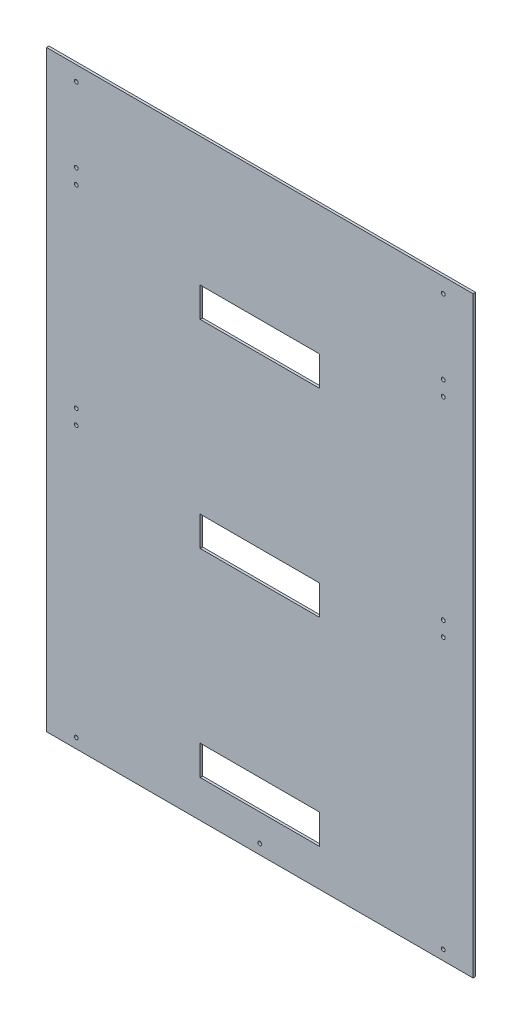
ISO-10303-21;
HEADER;
FILE_DESCRIPTION(('STEP AP214'),'2;1');
FILE_NAME('part.step','',(''),(''),'','','');
FILE_SCHEMA(('AUTOMOTIVE_DESIGN { 1 0 10303 214 1 1 1 1 }'));
ENDSEC;
DATA;
#1=APPLICATION_CONTEXT('core data for automotive mechanical design processes');
#2=APPLICATION_PROTOCOL_DEFINITION('international standard','automotive_design',2000,#1);
#3=PRODUCT_CONTEXT('',#1,'mechanical');
#4=PRODUCT('Part','Part','',(#3));
#5=PRODUCT_RELATED_PRODUCT_CATEGORY('part','',(#4));
#6=PRODUCT_DEFINITION_FORMATION('','',#4);
#7=PRODUCT_DEFINITION_CONTEXT('part definition',#1,'design');
#8=PRODUCT_DEFINITION('design','',#6,#7);
#9=PRODUCT_DEFINITION_SHAPE('','',#8);
#10=(LENGTH_UNIT() NAMED_UNIT(*) SI_UNIT(.MILLI.,.METRE.));
#11=(NAMED_UNIT(*) PLANE_ANGLE_UNIT() SI_UNIT($,.RADIAN.));
#12=(NAMED_UNIT(*) SI_UNIT($,.STERADIAN.) SOLID_ANGLE_UNIT());
#13=UNCERTAINTY_MEASURE_WITH_UNIT(LENGTH_MEASURE(1.E-05),#10,'distance_accuracy_value','');
#14=(GEOMETRIC_REPRESENTATION_CONTEXT(3) GLOBAL_UNCERTAINTY_ASSIGNED_CONTEXT((#13)) GLOBAL_UNIT_ASSIGNED_CONTEXT((#10,
#11,#12)) REPRESENTATION_CONTEXT('',''));
#15=CARTESIAN_POINT('',(0.,0.,0.));
#16=DIRECTION('',(0.,0.,1.));
#17=DIRECTION('',(1.,0.,0.));
#18=AXIS2_PLACEMENT_3D('',#15,#16,#17);
#19=CARTESIAN_POINT('',(469.9,-733.425,-1869.81354284324));
#20=DIRECTION('',(0.,0.,1.));
#21=DIRECTION('',(1.,0.,0.));
#22=AXIS2_PLACEMENT_3D('',#19,#20,#21);
#23=CYLINDRICAL_SURFACE('',#22,4.826);
#24=CARTESIAN_POINT('',(469.9,-733.425,-6.3499999999999));
#25=DIRECTION('',(0.,0.,1.));
#26=DIRECTION('',(1.,0.,0.));
#27=AXIS2_PLACEMENT_3D('',#24,#25,#26);
#28=CIRCLE('',#27,4.826);
#29=CARTESIAN_POINT('',(474.726,-733.425,-6.3499999999999));
#30=VERTEX_POINT('',#29);
#31=EDGE_CURVE('E157',#30,#30,#28,.T.);
#32=ORIENTED_EDGE('',*,*,#31,.F.);
#33=EDGE_LOOP('',(#32));
#34=FACE_BOUND('',#33,.T.);
#35=CARTESIAN_POINT('',(469.9,-733.425,0.));
#36=DIRECTION('',(0.,0.,-1.));
#37=DIRECTION('',(0.,-1.,0.));
#38=AXIS2_PLACEMENT_3D('',#35,#36,#37);
#39=CIRCLE('',#38,4.826);
#40=CARTESIAN_POINT('',(469.9,-738.251,0.));
#41=VERTEX_POINT('',#40);
#42=EDGE_CURVE('E176',#41,#41,#39,.T.);
#43=ORIENTED_EDGE('',*,*,#42,.F.);
#44=EDGE_LOOP('',(#43));
#45=FACE_BOUND('',#44,.T.);
#46=ADVANCED_FACE('F16',(#34,#45),#23,.F.);
#47=CARTESIAN_POINT('',(469.9,-3.17499999999995,-1869.81354284324));
#48=DIRECTION('',(0.,0.,1.));
#49=DIRECTION('',(1.,0.,0.));
#50=AXIS2_PLACEMENT_3D('',#47,#48,#49);
#51=CYLINDRICAL_SURFACE('',#50,4.826);
#52=CARTESIAN_POINT('',(469.9,-3.17499999999995,-6.3499999999999));
#53=DIRECTION('',(0.,0.,1.));
#54=DIRECTION('',(1.,0.,0.));
#55=AXIS2_PLACEMENT_3D('',#52,#53,#54);
#56=CIRCLE('',#55,4.826);
#57=CARTESIAN_POINT('',(474.726,-3.17499999999995,-6.3499999999999));
#58=VERTEX_POINT('',#57);
#59=EDGE_CURVE('E612',#58,#58,#56,.T.);
#60=ORIENTED_EDGE('',*,*,#59,.F.);
#61=EDGE_LOOP('',(#60));
#62=FACE_BOUND('',#61,.T.);
#63=CARTESIAN_POINT('',(469.9,-3.17499999999995,0.));
#64=DIRECTION('',(0.,0.,-1.));
#65=DIRECTION('',(0.,-1.,0.));
#66=AXIS2_PLACEMENT_3D('',#63,#64,#65);
#67=CIRCLE('',#66,4.826);
#68=CARTESIAN_POINT('',(469.9,-8.00099999999995,0.));
#69=VERTEX_POINT('',#68);
#70=EDGE_CURVE('E609',#69,#69,#67,.T.);
#71=ORIENTED_EDGE('',*,*,#70,.F.);
#72=EDGE_LOOP('',(#71));
#73=FACE_BOUND('',#72,.T.);
#74=ADVANCED_FACE('F196',(#62,#73),#51,.F.);
#75=CARTESIAN_POINT('',(469.9,530.225,-1869.81354284324));
#76=DIRECTION('',(0.,0.,1.));
#77=DIRECTION('',(1.,0.,0.));
#78=AXIS2_PLACEMENT_3D('',#75,#76,#77);
#79=CYLINDRICAL_SURFACE('',#78,4.826);
#80=CARTESIAN_POINT('',(469.9,530.225,-6.3499999999999));
#81=DIRECTION('',(0.,0.,1.));
#82=DIRECTION('',(1.,0.,0.));
#83=AXIS2_PLACEMENT_3D('',#80,#81,#82);
#84=CIRCLE('',#83,4.826);
#85=CARTESIAN_POINT('',(474.726,530.225,-6.3499999999999));
#86=VERTEX_POINT('',#85);
#87=EDGE_CURVE('E606',#86,#86,#84,.T.);
#88=ORIENTED_EDGE('',*,*,#87,.F.);
#89=EDGE_LOOP('',(#88));
#90=FACE_BOUND('',#89,.T.);
#91=CARTESIAN_POINT('',(469.9,530.225,0.));
#92=DIRECTION('',(0.,0.,-1.));
#93=DIRECTION('',(0.,-1.,0.));
#94=AXIS2_PLACEMENT_3D('',#91,#92,#93);
#95=CIRCLE('',#94,4.826);
#96=CARTESIAN_POINT('',(469.9,525.399,0.));
#97=VERTEX_POINT('',#96);
#98=EDGE_CURVE('E603',#97,#97,#95,.T.);
#99=ORIENTED_EDGE('',*,*,#98,.F.);
#100=EDGE_LOOP('',(#99));
#101=FACE_BOUND('',#100,.T.);
#102=ADVANCED_FACE('F202',(#90,#101),#79,.F.);
#103=CARTESIAN_POINT('',(-469.9,-733.425,-1869.81354284324));
#104=DIRECTION('',(0.,0.,1.));
#105=DIRECTION('',(1.,0.,0.));
#106=AXIS2_PLACEMENT_3D('',#103,#104,#105);
#107=CYLINDRICAL_SURFACE('',#106,4.826);
#108=CARTESIAN_POINT('',(-469.9,-733.425,-6.3499999999999));
#109=DIRECTION('',(0.,0.,1.));
#110=DIRECTION('',(1.,0.,0.));
#111=AXIS2_PLACEMENT_3D('',#108,#109,#110);
#112=CIRCLE('',#111,4.826);
#113=CARTESIAN_POINT('',(-465.074,-733.425,-6.3499999999999));
#114=VERTEX_POINT('',#113);
#115=EDGE_CURVE('E600',#114,#114,#112,.T.);
#116=ORIENTED_EDGE('',*,*,#115,.F.);
#117=EDGE_LOOP('',(#116));
#118=FACE_BOUND('',#117,.T.);
#119=CARTESIAN_POINT('',(-469.9,-733.425,0.));
#120=DIRECTION('',(0.,0.,-1.));
#121=DIRECTION('',(0.,-1.,0.));
#122=AXIS2_PLACEMENT_3D('',#119,#120,#121);
#123=CIRCLE('',#122,4.826);
#124=CARTESIAN_POINT('',(-469.9,-738.251,0.));
#125=VERTEX_POINT('',#124);
#126=EDGE_CURVE('E597',#125,#125,#123,.T.);
#127=ORIENTED_EDGE('',*,*,#126,.F.);
#128=EDGE_LOOP('',(#127));
#129=FACE_BOUND('',#128,.T.);
#130=ADVANCED_FACE('F212',(#118,#129),#107,.F.);
#131=CARTESIAN_POINT('',(-469.9,-3.17499999999995,-1869.81354284324));
#132=DIRECTION('',(0.,0.,1.));
#133=DIRECTION('',(1.,0.,0.));
#134=AXIS2_PLACEMENT_3D('',#131,#132,#133);
#135=CYLINDRICAL_SURFACE('',#134,4.826);
#136=CARTESIAN_POINT('',(-469.9,-3.17499999999995,-6.3499999999999));
#137=DIRECTION('',(0.,0.,1.));
#138=DIRECTION('',(1.,0.,0.));
#139=AXIS2_PLACEMENT_3D('',#136,#137,#138);
#140=CIRCLE('',#139,4.826);
#141=CARTESIAN_POINT('',(-465.074,-3.17499999999995,-6.3499999999999));
#142=VERTEX_POINT('',#141);
#143=EDGE_CURVE('E594',#142,#142,#140,.T.);
#144=ORIENTED_EDGE('',*,*,#143,.F.);
#145=EDGE_LOOP('',(#144));
#146=FACE_BOUND('',#145,.T.);
#147=CARTESIAN_POINT('',(-469.9,-3.17499999999995,0.));
#148=DIRECTION('',(0.,0.,-1.));
#149=DIRECTION('',(0.,-1.,0.));
#150=AXIS2_PLACEMENT_3D('',#147,#148,#149);
#151=CIRCLE('',#150,4.826);
#152=CARTESIAN_POINT('',(-469.9,-8.00099999999995,0.));
#153=VERTEX_POINT('',#152);
#154=EDGE_CURVE('E591',#153,#153,#151,.T.);
#155=ORIENTED_EDGE('',*,*,#154,.F.);
#156=EDGE_LOOP('',(#155));
#157=FACE_BOUND('',#156,.T.);
#158=ADVANCED_FACE('F216',(#146,#157),#135,.F.);
#159=CARTESIAN_POINT('',(-469.9,530.225,-1869.81354284324));
#160=DIRECTION('',(0.,0.,1.));
#161=DIRECTION('',(1.,0.,0.));
#162=AXIS2_PLACEMENT_3D('',#159,#160,#161);
#163=CYLINDRICAL_SURFACE('',#162,4.826);
#164=CARTESIAN_POINT('',(-469.9,530.225,-6.3499999999999));
#165=DIRECTION('',(0.,0.,1.));
#166=DIRECTION('',(1.,0.,0.));
#167=AXIS2_PLACEMENT_3D('',#164,#165,#166);
#168=CIRCLE('',#167,4.826);
#169=CARTESIAN_POINT('',(-465.074,530.225,-6.3499999999999));
#170=VERTEX_POINT('',#169);
#171=EDGE_CURVE('E588',#170,#170,#168,.T.);
#172=ORIENTED_EDGE('',*,*,#171,.F.);
#173=EDGE_LOOP('',(#172));
#174=FACE_BOUND('',#173,.T.);
#175=CARTESIAN_POINT('',(-469.9,530.225,0.));
#176=DIRECTION('',(0.,0.,-1.));
#177=DIRECTION('',(0.,-1.,0.));
#178=AXIS2_PLACEMENT_3D('',#175,#176,#177);
#179=CIRCLE('',#178,4.826);
#180=CARTESIAN_POINT('',(-469.9,525.399,0.));
#181=VERTEX_POINT('',#180);
#182=EDGE_CURVE('E585',#181,#181,#179,.T.);
#183=ORIENTED_EDGE('',*,*,#182,.F.);
#184=EDGE_LOOP('',(#183));
#185=FACE_BOUND('',#184,.T.);
#186=ADVANCED_FACE('F220',(#174,#185),#163,.F.);
#187=CARTESIAN_POINT('',(-469.9,720.725,-1869.81354284324));
#188=DIRECTION('',(0.,0.,1.));
#189=DIRECTION('',(1.,0.,0.));
#190=AXIS2_PLACEMENT_3D('',#187,#188,#189);
#191=CYLINDRICAL_SURFACE('',#190,4.826);
#192=CARTESIAN_POINT('',(-469.9,720.725,-6.3499999999999));
#193=DIRECTION('',(0.,0.,1.));
#194=DIRECTION('',(1.,0.,0.));
#195=AXIS2_PLACEMENT_3D('',#192,#193,#194);
#196=CIRCLE('',#195,4.826);
#197=CARTESIAN_POINT('',(-465.074,720.725,-6.3499999999999));
#198=VERTEX_POINT('',#197);
#199=EDGE_CURVE('E582',#198,#198,#196,.T.);
#200=ORIENTED_EDGE('',*,*,#199,.F.);
#201=EDGE_LOOP('',(#200));
#202=FACE_BOUND('',#201,.T.);
#203=CARTESIAN_POINT('',(-469.9,720.725,0.));
#204=DIRECTION('',(0.,0.,-1.));
#205=DIRECTION('',(0.,-1.,0.));
#206=AXIS2_PLACEMENT_3D('',#203,#204,#205);
#207=CIRCLE('',#206,4.826);
#208=CARTESIAN_POINT('',(-469.9,715.899,0.));
#209=VERTEX_POINT('',#208);
#210=EDGE_CURVE('E579',#209,#209,#207,.T.);
#211=ORIENTED_EDGE('',*,*,#210,.F.);
#212=EDGE_LOOP('',(#211));
#213=FACE_BOUND('',#212,.T.);
#214=ADVANCED_FACE('F224',(#202,#213),#191,.F.);
#215=CARTESIAN_POINT('',(-469.9,492.379,-1869.81354284324));
#216=DIRECTION('',(0.,0.,1.));
#217=DIRECTION('',(1.,0.,0.));
#218=AXIS2_PLACEMENT_3D('',#215,#216,#217);
#219=CYLINDRICAL_SURFACE('',#218,4.826);
#220=CARTESIAN_POINT('',(-469.9,492.379,-6.3499999999999));
#221=DIRECTION('',(0.,0.,1.));
#222=DIRECTION('',(1.,0.,0.));
#223=AXIS2_PLACEMENT_3D('',#220,#221,#222);
#224=CIRCLE('',#223,4.826);
#225=CARTESIAN_POINT('',(-465.074,492.379,-6.3499999999999));
#226=VERTEX_POINT('',#225);
#227=EDGE_CURVE('E576',#226,#226,#224,.T.);
#228=ORIENTED_EDGE('',*,*,#227,.F.);
#229=EDGE_LOOP('',(#228));
#230=FACE_BOUND('',#229,.T.);
#231=CARTESIAN_POINT('',(-469.9,492.379,0.));
#232=DIRECTION('',(0.,0.,-1.));
#233=DIRECTION('',(0.,-1.,0.));
#234=AXIS2_PLACEMENT_3D('',#231,#232,#233);
#235=CIRCLE('',#234,4.826);
#236=CARTESIAN_POINT('',(-469.9,487.553,0.));
#237=VERTEX_POINT('',#236);
#238=EDGE_CURVE('E573',#237,#237,#235,.T.);
#239=ORIENTED_EDGE('',*,*,#238,.F.);
#240=EDGE_LOOP('',(#239));
#241=FACE_BOUND('',#240,.T.);
#242=ADVANCED_FACE('F228',(#230,#241),#219,.F.);
#243=CARTESIAN_POINT('',(-469.9,-41.0209999999999,-1869.81354284324));
#244=DIRECTION('',(0.,0.,1.));
#245=DIRECTION('',(1.,0.,0.));
#246=AXIS2_PLACEMENT_3D('',#243,#244,#245);
#247=CYLINDRICAL_SURFACE('',#246,4.826);
#248=CARTESIAN_POINT('',(-469.9,-41.0209999999999,-6.3499999999999));
#249=DIRECTION('',(0.,0.,1.));
#250=DIRECTION('',(1.,0.,0.));
#251=AXIS2_PLACEMENT_3D('',#248,#249,#250);
#252=CIRCLE('',#251,4.826);
#253=CARTESIAN_POINT('',(-465.074,-41.0209999999999,-6.3499999999999));
#254=VERTEX_POINT('',#253);
#255=EDGE_CURVE('E565',#254,#254,#252,.T.);
#256=ORIENTED_EDGE('',*,*,#255,.F.);
#257=EDGE_LOOP('',(#256));
#258=FACE_BOUND('',#257,.T.);
#259=CARTESIAN_POINT('',(-469.9,-41.0209999999999,0.));
#260=DIRECTION('',(0.,0.,-1.));
#261=DIRECTION('',(0.,-1.,0.));
#262=AXIS2_PLACEMENT_3D('',#259,#260,#261);
#263=CIRCLE('',#262,4.826);
#264=CARTESIAN_POINT('',(-469.9,-45.8469999999999,0.));
#265=VERTEX_POINT('',#264);
#266=EDGE_CURVE('E569',#265,#265,#263,.T.);
#267=ORIENTED_EDGE('',*,*,#266,.F.);
#268=EDGE_LOOP('',(#267));
#269=FACE_BOUND('',#268,.T.);
#270=ADVANCED_FACE('F232',(#258,#269),#247,.F.);
#271=CARTESIAN_POINT('',(469.9,720.725,-1869.81354284324));
#272=DIRECTION('',(0.,0.,1.));
#273=DIRECTION('',(1.,0.,0.));
#274=AXIS2_PLACEMENT_3D('',#271,#272,#273);
#275=CYLINDRICAL_SURFACE('',#274,4.826);
#276=CARTESIAN_POINT('',(469.9,720.725,-6.3499999999999));
#277=DIRECTION('',(0.,0.,1.));
#278=DIRECTION('',(1.,0.,0.));
#279=AXIS2_PLACEMENT_3D('',#276,#277,#278);
#280=CIRCLE('',#279,4.826);
#281=CARTESIAN_POINT('',(474.726,720.725,-6.3499999999999));
#282=VERTEX_POINT('',#281);
#283=EDGE_CURVE('E560',#282,#282,#280,.T.);
#284=ORIENTED_EDGE('',*,*,#283,.F.);
#285=EDGE_LOOP('',(#284));
#286=FACE_BOUND('',#285,.T.);
#287=CARTESIAN_POINT('',(469.9,720.725,0.));
#288=DIRECTION('',(0.,0.,-1.));
#289=DIRECTION('',(0.,-1.,0.));
#290=AXIS2_PLACEMENT_3D('',#287,#288,#289);
#291=CIRCLE('',#290,4.826);
#292=CARTESIAN_POINT('',(469.9,715.899,0.));
#293=VERTEX_POINT('',#292);
#294=EDGE_CURVE('E264',#293,#293,#291,.T.);
#295=ORIENTED_EDGE('',*,*,#294,.F.);
#296=EDGE_LOOP('',(#295));
#297=FACE_BOUND('',#296,.T.);
#298=ADVANCED_FACE('F236',(#286,#297),#275,.F.);
#299=CARTESIAN_POINT('',(469.9,492.379,-1869.81354284324));
#300=DIRECTION('',(0.,0.,1.));
#301=DIRECTION('',(1.,0.,0.));
#302=AXIS2_PLACEMENT_3D('',#299,#300,#301);
#303=CYLINDRICAL_SURFACE('',#302,4.826);
#304=CARTESIAN_POINT('',(469.9,492.379,-6.3499999999999));
#305=DIRECTION('',(0.,0.,1.));
#306=DIRECTION('',(1.,0.,0.));
#307=AXIS2_PLACEMENT_3D('',#304,#305,#306);
#308=CIRCLE('',#307,4.826);
#309=CARTESIAN_POINT('',(474.726,492.379,-6.3499999999999));
#310=VERTEX_POINT('',#309);
#311=EDGE_CURVE('E557',#310,#310,#308,.T.);
#312=ORIENTED_EDGE('',*,*,#311,.F.);
#313=EDGE_LOOP('',(#312));
#314=FACE_BOUND('',#313,.T.);
#315=CARTESIAN_POINT('',(469.9,492.379,0.));
#316=DIRECTION('',(0.,0.,-1.));
#317=DIRECTION('',(0.,-1.,0.));
#318=AXIS2_PLACEMENT_3D('',#315,#316,#317);
#319=CIRCLE('',#318,4.826);
#320=CARTESIAN_POINT('',(469.9,487.553,0.));
#321=VERTEX_POINT('',#320);
#322=EDGE_CURVE('E260',#321,#321,#319,.T.);
#323=ORIENTED_EDGE('',*,*,#322,.F.);
#324=EDGE_LOOP('',(#323));
#325=FACE_BOUND('',#324,.T.);
#326=ADVANCED_FACE('F240',(#314,#325),#303,.F.);
#327=CARTESIAN_POINT('',(469.9,-41.0209999999999,-1869.81354284324));
#328=DIRECTION('',(0.,0.,1.));
#329=DIRECTION('',(1.,0.,0.));
#330=AXIS2_PLACEMENT_3D('',#327,#328,#329);
#331=CYLINDRICAL_SURFACE('',#330,4.826);
#332=CARTESIAN_POINT('',(469.9,-41.0209999999999,-6.3499999999999));
#333=DIRECTION('',(0.,0.,1.));
#334=DIRECTION('',(1.,0.,0.));
#335=AXIS2_PLACEMENT_3D('',#332,#333,#334);
#336=CIRCLE('',#335,4.826);
#337=CARTESIAN_POINT('',(474.726,-41.0209999999999,-6.3499999999999));
#338=VERTEX_POINT('',#337);
#339=EDGE_CURVE('E255',#338,#338,#336,.T.);
#340=ORIENTED_EDGE('',*,*,#339,.F.);
#341=EDGE_LOOP('',(#340));
#342=FACE_BOUND('',#341,.T.);
#343=CARTESIAN_POINT('',(469.9,-41.0209999999999,0.));
#344=DIRECTION('',(0.,0.,-1.));
#345=DIRECTION('',(0.,-1.,0.));
#346=AXIS2_PLACEMENT_3D('',#343,#344,#345);
#347=CIRCLE('',#346,4.826);
#348=CARTESIAN_POINT('',(469.9,-45.8469999999999,0.));
#349=VERTEX_POINT('',#348);
#350=EDGE_CURVE('E258',#349,#349,#347,.T.);
#351=ORIENTED_EDGE('',*,*,#350,.F.);
#352=EDGE_LOOP('',(#351));
#353=FACE_BOUND('',#352,.T.);
#354=ADVANCED_FACE('F243',(#342,#353),#331,.F.);
#355=CARTESIAN_POINT('',(0.,-733.425,-1869.81354284324));
#356=DIRECTION('',(0.,0.,1.));
#357=DIRECTION('',(1.,0.,0.));
#358=AXIS2_PLACEMENT_3D('',#355,#356,#357);
#359=CYLINDRICAL_SURFACE('',#358,4.826);
#360=CARTESIAN_POINT('',(0.,-733.425,-6.3499999999999));
#361=DIRECTION('',(0.,0.,1.));
#362=DIRECTION('',(1.,0.,0.));
#363=AXIS2_PLACEMENT_3D('',#360,#361,#362);
#364=CIRCLE('',#363,4.826);
#365=CARTESIAN_POINT('',(4.826,-733.425,-6.3499999999999));
#366=VERTEX_POINT('',#365);
#367=EDGE_CURVE('E271',#366,#366,#364,.T.);
#368=ORIENTED_EDGE('',*,*,#367,.F.);
#369=EDGE_LOOP('',(#368));
#370=FACE_BOUND('',#369,.T.);
#371=CARTESIAN_POINT('',(0.,-733.425,0.));
#372=DIRECTION('',(0.,0.,-1.));
#373=DIRECTION('',(0.,-1.,0.));
#374=AXIS2_PLACEMENT_3D('',#371,#372,#373);
#375=CIRCLE('',#374,4.826);
#376=CARTESIAN_POINT('',(0.,-738.251,0.));
#377=VERTEX_POINT('',#376);
#378=EDGE_CURVE('E261',#377,#377,#375,.T.);
#379=ORIENTED_EDGE('',*,*,#378,.F.);
#380=EDGE_LOOP('',(#379));
#381=FACE_BOUND('',#380,.T.);
#382=ADVANCED_FACE('F18',(#370,#381),#359,.F.);
#383=CARTESIAN_POINT('',(-152.4,-155.575,0.));
#384=DIRECTION('',(-1.,0.,0.));
#385=DIRECTION('',(0.,0.,1.));
#386=AXIS2_PLACEMENT_3D('',#383,#384,#385);
#387=PLANE('',#386);
#388=DIRECTION('',(0.,-1.,0.));
#389=VECTOR('',#388,1.);
#390=CARTESIAN_POINT('',(-152.4,-79.375,-6.35));
#391=LINE('',#390,#389);
#392=CARTESIAN_POINT('',(-152.4,-79.375,-6.35));
#393=VERTEX_POINT('',#392);
#394=CARTESIAN_POINT('',(-152.4,-155.575,-6.35));
#395=VERTEX_POINT('',#394);
#396=EDGE_CURVE('E34',#393,#395,#391,.T.);
#397=ORIENTED_EDGE('',*,*,#396,.F.);
#398=DIRECTION('',(0.,0.,-1.));
#399=VECTOR('',#398,1.);
#400=CARTESIAN_POINT('',(-152.4,-79.375,0.));
#401=LINE('',#400,#399);
#402=CARTESIAN_POINT('',(-152.4,-79.375,0.));
#403=VERTEX_POINT('',#402);
#404=EDGE_CURVE('E278',#403,#393,#401,.T.);
#405=ORIENTED_EDGE('',*,*,#404,.F.);
#406=DIRECTION('',(0.,1.,0.));
#407=VECTOR('',#406,1.);
#408=CARTESIAN_POINT('',(-152.4,-155.575,0.));
#409=LINE('',#408,#407);
#410=CARTESIAN_POINT('',(-152.4,-155.575,0.));
#411=VERTEX_POINT('',#410);
#412=EDGE_CURVE('E282',#411,#403,#409,.T.);
#413=ORIENTED_EDGE('',*,*,#412,.F.);
#414=DIRECTION('',(0.,0.,-1.));
#415=VECTOR('',#414,1.);
#416=CARTESIAN_POINT('',(-152.4,-155.575,0.));
#417=LINE('',#416,#415);
#418=EDGE_CURVE('E10',#411,#395,#417,.T.);
#419=ORIENTED_EDGE('',*,*,#418,.T.);
#420=EDGE_LOOP('',(#397,#405,#413,#419));
#421=FACE_BOUND('',#420,.T.);
#422=ADVANCED_FACE('F250',(#421),#387,.F.);
#423=CARTESIAN_POINT('',(152.4,-155.575,0.));
#424=DIRECTION('',(0.,-1.,0.));
#425=DIRECTION('',(0.,0.,-1.));
#426=AXIS2_PLACEMENT_3D('',#423,#424,#425);
#427=PLANE('',#426);
#428=DIRECTION('',(1.,0.,0.));
#429=VECTOR('',#428,1.);
#430=CARTESIAN_POINT('',(-152.4,-155.575,-6.35));
#431=LINE('',#430,#429);
#432=CARTESIAN_POINT('',(152.4,-155.575,-6.35));
#433=VERTEX_POINT('',#432);
#434=EDGE_CURVE('E277',#395,#433,#431,.T.);
#435=ORIENTED_EDGE('',*,*,#434,.F.);
#436=ORIENTED_EDGE('',*,*,#418,.F.);
#437=DIRECTION('',(-1.,0.,0.));
#438=VECTOR('',#437,1.);
#439=CARTESIAN_POINT('',(152.4,-155.575,0.));
#440=LINE('',#439,#438);
#441=CARTESIAN_POINT('',(152.4,-155.575,0.));
#442=VERTEX_POINT('',#441);
#443=EDGE_CURVE('E283',#442,#411,#440,.T.);
#444=ORIENTED_EDGE('',*,*,#443,.F.);
#445=DIRECTION('',(0.,0.,-1.));
#446=VECTOR('',#445,1.);
#447=CARTESIAN_POINT('',(152.4,-155.575,0.));
#448=LINE('',#447,#446);
#449=EDGE_CURVE('E26',#442,#433,#448,.T.);
#450=ORIENTED_EDGE('',*,*,#449,.T.);
#451=EDGE_LOOP('',(#435,#436,#444,#450));
#452=FACE_BOUND('',#451,.T.);
#453=ADVANCED_FACE('F466',(#452),#427,.F.);
#454=CARTESIAN_POINT('',(152.4,-79.375,0.));
#455=DIRECTION('',(1.,0.,0.));
#456=DIRECTION('',(0.,0.,-1.));
#457=AXIS2_PLACEMENT_3D('',#454,#455,#456);
#458=PLANE('',#457);
#459=DIRECTION('',(0.,1.,0.));
#460=VECTOR('',#459,1.);
#461=CARTESIAN_POINT('',(152.4,-155.575,-6.35));
#462=LINE('',#461,#460);
#463=CARTESIAN_POINT('',(152.4,-79.375,-6.35));
#464=VERTEX_POINT('',#463);
#465=EDGE_CURVE('E273',#433,#464,#462,.T.);
#466=ORIENTED_EDGE('',*,*,#465,.F.);
#467=ORIENTED_EDGE('',*,*,#449,.F.);
#468=DIRECTION('',(0.,-1.,0.));
#469=VECTOR('',#468,1.);
#470=CARTESIAN_POINT('',(152.4,-79.375,0.));
#471=LINE('',#470,#469);
#472=CARTESIAN_POINT('',(152.4,-79.375,0.));
#473=VERTEX_POINT('',#472);
#474=EDGE_CURVE('E267',#473,#442,#471,.T.);
#475=ORIENTED_EDGE('',*,*,#474,.F.);
#476=DIRECTION('',(0.,0.,-1.));
#477=VECTOR('',#476,1.);
#478=CARTESIAN_POINT('',(152.4,-79.375,0.));
#479=LINE('',#478,#477);
#480=EDGE_CURVE('E280',#473,#464,#479,.T.);
#481=ORIENTED_EDGE('',*,*,#480,.T.);
#482=EDGE_LOOP('',(#466,#467,#475,#481));
#483=FACE_BOUND('',#482,.T.);
#484=ADVANCED_FACE('F458',(#483),#458,.F.);
#485=CARTESIAN_POINT('',(-152.4,-79.375,0.));
#486=DIRECTION('',(0.,1.,0.));
#487=DIRECTION('',(0.,0.,1.));
#488=AXIS2_PLACEMENT_3D('',#485,#486,#487);
#489=PLANE('',#488);
#490=DIRECTION('',(-1.,0.,0.));
#491=VECTOR('',#490,1.);
#492=CARTESIAN_POINT('',(152.4,-79.375,-6.35));
#493=LINE('',#492,#491);
#494=EDGE_CURVE('E276',#464,#393,#493,.T.);
#495=ORIENTED_EDGE('',*,*,#494,.F.);
#496=ORIENTED_EDGE('',*,*,#480,.F.);
#497=DIRECTION('',(1.,0.,0.));
#498=VECTOR('',#497,1.);
#499=CARTESIAN_POINT('',(-152.4,-79.375,0.));
#500=LINE('',#499,#498);
#501=EDGE_CURVE('E284',#403,#473,#500,.T.);
#502=ORIENTED_EDGE('',*,*,#501,.F.);
#503=ORIENTED_EDGE('',*,*,#404,.T.);
#504=EDGE_LOOP('',(#495,#496,#502,#503));
#505=FACE_BOUND('',#504,.T.);
#506=ADVANCED_FACE('F450',(#505),#489,.F.);
#507=CARTESIAN_POINT('',(-152.4,352.425,0.));
#508=DIRECTION('',(-1.,0.,0.));
#509=DIRECTION('',(0.,0.,1.));
#510=AXIS2_PLACEMENT_3D('',#507,#508,#509);
#511=PLANE('',#510);
#512=DIRECTION('',(0.,-1.,0.));
#513=VECTOR('',#512,1.);
#514=CARTESIAN_POINT('',(-152.4,428.625,-6.35));
#515=LINE('',#514,#513);
#516=CARTESIAN_POINT('',(-152.4,428.625,-6.35));
#517=VERTEX_POINT('',#516);
#518=CARTESIAN_POINT('',(-152.4,352.425,-6.35));
#519=VERTEX_POINT('',#518);
#520=EDGE_CURVE('E302',#517,#519,#515,.T.);
#521=ORIENTED_EDGE('',*,*,#520,.F.);
#522=DIRECTION('',(0.,0.,-1.));
#523=VECTOR('',#522,1.);
#524=CARTESIAN_POINT('',(-152.4,428.625,0.));
#525=LINE('',#524,#523);
#526=CARTESIAN_POINT('',(-152.4,428.625,0.));
#527=VERTEX_POINT('',#526);
#528=EDGE_CURVE('E306',#527,#517,#525,.T.);
#529=ORIENTED_EDGE('',*,*,#528,.F.);
#530=DIRECTION('',(0.,1.,0.));
#531=VECTOR('',#530,1.);
#532=CARTESIAN_POINT('',(-152.4,352.425,0.));
#533=LINE('',#532,#531);
#534=CARTESIAN_POINT('',(-152.4,352.425,0.));
#535=VERTEX_POINT('',#534);
#536=EDGE_CURVE('E311',#535,#527,#533,.T.);
#537=ORIENTED_EDGE('',*,*,#536,.F.);
#538=DIRECTION('',(0.,0.,-1.));
#539=VECTOR('',#538,1.);
#540=CARTESIAN_POINT('',(-152.4,352.425,0.));
#541=LINE('',#540,#539);
#542=EDGE_CURVE('E281',#535,#519,#541,.T.);
#543=ORIENTED_EDGE('',*,*,#542,.T.);
#544=EDGE_LOOP('',(#521,#529,#537,#543));
#545=FACE_BOUND('',#544,.T.);
#546=ADVANCED_FACE('F442',(#545),#511,.F.);
#547=CARTESIAN_POINT('',(152.4,352.425,0.));
#548=DIRECTION('',(0.,-1.,0.));
#549=DIRECTION('',(0.,0.,-1.));
#550=AXIS2_PLACEMENT_3D('',#547,#548,#549);
#551=PLANE('',#550);
#552=DIRECTION('',(1.,0.,0.));
#553=VECTOR('',#552,1.);
#554=CARTESIAN_POINT('',(-152.4,352.425,-6.35));
#555=LINE('',#554,#553);
#556=CARTESIAN_POINT('',(152.4,352.425,-6.35));
#557=VERTEX_POINT('',#556);
#558=EDGE_CURVE('E305',#519,#557,#555,.T.);
#559=ORIENTED_EDGE('',*,*,#558,.F.);
#560=ORIENTED_EDGE('',*,*,#542,.F.);
#561=DIRECTION('',(-1.,0.,0.));
#562=VECTOR('',#561,1.);
#563=CARTESIAN_POINT('',(152.4,352.425,0.));
#564=LINE('',#563,#562);
#565=CARTESIAN_POINT('',(152.4,352.425,0.));
#566=VERTEX_POINT('',#565);
#567=EDGE_CURVE('E313',#566,#535,#564,.T.);
#568=ORIENTED_EDGE('',*,*,#567,.F.);
#569=DIRECTION('',(0.,0.,-1.));
#570=VECTOR('',#569,1.);
#571=CARTESIAN_POINT('',(152.4,352.425,0.));
#572=LINE('',#571,#570);
#573=EDGE_CURVE('E317',#566,#557,#572,.T.);
#574=ORIENTED_EDGE('',*,*,#573,.T.);
#575=EDGE_LOOP('',(#559,#560,#568,#574));
#576=FACE_BOUND('',#575,.T.);
#577=ADVANCED_FACE('F434',(#576),#551,.F.);
#578=CARTESIAN_POINT('',(152.4,428.625,0.));
#579=DIRECTION('',(1.,0.,0.));
#580=DIRECTION('',(0.,0.,-1.));
#581=AXIS2_PLACEMENT_3D('',#578,#579,#580);
#582=PLANE('',#581);
#583=DIRECTION('',(0.,1.,0.));
#584=VECTOR('',#583,1.);
#585=CARTESIAN_POINT('',(152.4,352.425,-6.35));
#586=LINE('',#585,#584);
#587=CARTESIAN_POINT('',(152.4,428.625,-6.35));
#588=VERTEX_POINT('',#587);
#589=EDGE_CURVE('E287',#557,#588,#586,.T.);
#590=ORIENTED_EDGE('',*,*,#589,.F.);
#591=ORIENTED_EDGE('',*,*,#573,.F.);
#592=DIRECTION('',(0.,-1.,0.));
#593=VECTOR('',#592,1.);
#594=CARTESIAN_POINT('',(152.4,428.625,0.));
#595=LINE('',#594,#593);
#596=CARTESIAN_POINT('',(152.4,428.625,0.));
#597=VERTEX_POINT('',#596);
#598=EDGE_CURVE('E301',#597,#566,#595,.T.);
#599=ORIENTED_EDGE('',*,*,#598,.F.);
#600=DIRECTION('',(0.,0.,-1.));
#601=VECTOR('',#600,1.);
#602=CARTESIAN_POINT('',(152.4,428.625,0.));
#603=LINE('',#602,#601);
#604=EDGE_CURVE('E309',#597,#588,#603,.T.);
#605=ORIENTED_EDGE('',*,*,#604,.T.);
#606=EDGE_LOOP('',(#590,#591,#599,#605));
#607=FACE_BOUND('',#606,.T.);
#608=ADVANCED_FACE('F426',(#607),#582,.F.);
#609=CARTESIAN_POINT('',(-152.4,428.625,0.));
#610=DIRECTION('',(0.,1.,0.));
#611=DIRECTION('',(0.,0.,1.));
#612=AXIS2_PLACEMENT_3D('',#609,#610,#611);
#613=PLANE('',#612);
#614=DIRECTION('',(-1.,0.,0.));
#615=VECTOR('',#614,1.);
#616=CARTESIAN_POINT('',(152.4,428.625,-6.35));
#617=LINE('',#616,#615);
#618=EDGE_CURVE('E304',#588,#517,#617,.T.);
#619=ORIENTED_EDGE('',*,*,#618,.F.);
#620=ORIENTED_EDGE('',*,*,#604,.F.);
#621=DIRECTION('',(1.,0.,0.));
#622=VECTOR('',#621,1.);
#623=CARTESIAN_POINT('',(-152.4,428.625,0.));
#624=LINE('',#623,#622);
#625=EDGE_CURVE('E314',#527,#597,#624,.T.);
#626=ORIENTED_EDGE('',*,*,#625,.F.);
#627=ORIENTED_EDGE('',*,*,#528,.T.);
#628=EDGE_LOOP('',(#619,#620,#626,#627));
#629=FACE_BOUND('',#628,.T.);
#630=ADVANCED_FACE('F419',(#629),#613,.F.);
#631=CARTESIAN_POINT('',(-152.4,-663.575,0.));
#632=DIRECTION('',(-1.,0.,0.));
#633=DIRECTION('',(0.,0.,1.));
#634=AXIS2_PLACEMENT_3D('',#631,#632,#633);
#635=PLANE('',#634);
#636=DIRECTION('',(0.,-1.,0.));
#637=VECTOR('',#636,1.);
#638=CARTESIAN_POINT('',(-152.4,-587.375,-6.35));
#639=LINE('',#638,#637);
#640=CARTESIAN_POINT('',(-152.4,-587.375,-6.35));
#641=VERTEX_POINT('',#640);
#642=CARTESIAN_POINT('',(-152.4,-663.575,-6.35));
#643=VERTEX_POINT('',#642);
#644=EDGE_CURVE('E178',#641,#643,#639,.T.);
#645=ORIENTED_EDGE('',*,*,#644,.F.);
#646=DIRECTION('',(0.,0.,-1.));
#647=VECTOR('',#646,1.);
#648=CARTESIAN_POINT('',(-152.4,-587.375,0.));
#649=LINE('',#648,#647);
#650=CARTESIAN_POINT('',(-152.4,-587.375,0.));
#651=VERTEX_POINT('',#650);
#652=EDGE_CURVE('E162',#651,#641,#649,.T.);
#653=ORIENTED_EDGE('',*,*,#652,.F.);
#654=DIRECTION('',(0.,1.,0.));
#655=VECTOR('',#654,1.);
#656=CARTESIAN_POINT('',(-152.4,-663.575,0.));
#657=LINE('',#656,#655);
#658=CARTESIAN_POINT('',(-152.4,-663.575,0.));
#659=VERTEX_POINT('',#658);
#660=EDGE_CURVE('E336',#659,#651,#657,.T.);
#661=ORIENTED_EDGE('',*,*,#660,.F.);
#662=DIRECTION('',(0.,0.,-1.));
#663=VECTOR('',#662,1.);
#664=CARTESIAN_POINT('',(-152.4,-663.575,0.));
#665=LINE('',#664,#663);
#666=EDGE_CURVE('E310',#659,#643,#665,.T.);
#667=ORIENTED_EDGE('',*,*,#666,.T.);
#668=EDGE_LOOP('',(#645,#653,#661,#667));
#669=FACE_BOUND('',#668,.T.);
#670=ADVANCED_FACE('F369',(#669),#635,.F.);
#671=CARTESIAN_POINT('',(152.4,-663.575,0.));
#672=DIRECTION('',(0.,-1.,0.));
#673=DIRECTION('',(0.,0.,-1.));
#674=AXIS2_PLACEMENT_3D('',#671,#672,#673);
#675=PLANE('',#674);
#676=DIRECTION('',(1.,0.,0.));
#677=VECTOR('',#676,1.);
#678=CARTESIAN_POINT('',(-152.4,-663.575,-6.35));
#679=LINE('',#678,#677);
#680=CARTESIAN_POINT('',(152.4,-663.575,-6.35));
#681=VERTEX_POINT('',#680);
#682=EDGE_CURVE('E177',#643,#681,#679,.T.);
#683=ORIENTED_EDGE('',*,*,#682,.F.);
#684=ORIENTED_EDGE('',*,*,#666,.F.);
#685=DIRECTION('',(-1.,0.,0.));
#686=VECTOR('',#685,1.);
#687=CARTESIAN_POINT('',(152.4,-663.575,0.));
#688=LINE('',#687,#686);
#689=CARTESIAN_POINT('',(152.4,-663.575,0.));
#690=VERTEX_POINT('',#689);
#691=EDGE_CURVE('E338',#690,#659,#688,.T.);
#692=ORIENTED_EDGE('',*,*,#691,.F.);
#693=DIRECTION('',(0.,0.,-1.));
#694=VECTOR('',#693,1.);
#695=CARTESIAN_POINT('',(152.4,-663.575,0.));
#696=LINE('',#695,#694);
#697=EDGE_CURVE('E341',#690,#681,#696,.T.);
#698=ORIENTED_EDGE('',*,*,#697,.T.);
#699=EDGE_LOOP('',(#683,#684,#692,#698));
#700=FACE_BOUND('',#699,.T.);
#701=ADVANCED_FACE('F366',(#700),#675,.F.);
#702=CARTESIAN_POINT('',(152.4,-587.375,0.));
#703=DIRECTION('',(1.,0.,0.));
#704=DIRECTION('',(0.,0.,-1.));
#705=AXIS2_PLACEMENT_3D('',#702,#703,#704);
#706=PLANE('',#705);
#707=DIRECTION('',(0.,1.,0.));
#708=VECTOR('',#707,1.);
#709=CARTESIAN_POINT('',(152.4,-663.575,-6.35));
#710=LINE('',#709,#708);
#711=CARTESIAN_POINT('',(152.4,-587.375,-6.35));
#712=VERTEX_POINT('',#711);
#713=EDGE_CURVE('E319',#681,#712,#710,.T.);
#714=ORIENTED_EDGE('',*,*,#713,.F.);
#715=ORIENTED_EDGE('',*,*,#697,.F.);
#716=DIRECTION('',(0.,-1.,0.));
#717=VECTOR('',#716,1.);
#718=CARTESIAN_POINT('',(152.4,-587.375,0.));
#719=LINE('',#718,#717);
#720=CARTESIAN_POINT('',(152.4,-587.375,0.));
#721=VERTEX_POINT('',#720);
#722=EDGE_CURVE('E333',#721,#690,#719,.T.);
#723=ORIENTED_EDGE('',*,*,#722,.F.);
#724=DIRECTION('',(0.,0.,-1.));
#725=VECTOR('',#724,1.);
#726=CARTESIAN_POINT('',(152.4,-587.375,0.));
#727=LINE('',#726,#725);
#728=EDGE_CURVE('E166',#721,#712,#727,.T.);
#729=ORIENTED_EDGE('',*,*,#728,.T.);
#730=EDGE_LOOP('',(#714,#715,#723,#729));
#731=FACE_BOUND('',#730,.T.);
#732=ADVANCED_FACE('F362',(#731),#706,.F.);
#733=CARTESIAN_POINT('',(-152.4,-587.375,0.));
#734=DIRECTION('',(0.,1.,0.));
#735=DIRECTION('',(0.,0.,1.));
#736=AXIS2_PLACEMENT_3D('',#733,#734,#735);
#737=PLANE('',#736);
#738=DIRECTION('',(-1.,0.,0.));
#739=VECTOR('',#738,1.);
#740=CARTESIAN_POINT('',(152.4,-587.375,-6.35));
#741=LINE('',#740,#739);
#742=EDGE_CURVE('E334',#712,#641,#741,.T.);
#743=ORIENTED_EDGE('',*,*,#742,.F.);
#744=ORIENTED_EDGE('',*,*,#728,.F.);
#745=DIRECTION('',(1.,0.,0.));
#746=VECTOR('',#745,1.);
#747=CARTESIAN_POINT('',(-152.4,-587.375,0.));
#748=LINE('',#747,#746);
#749=EDGE_CURVE('E339',#651,#721,#748,.T.);
#750=ORIENTED_EDGE('',*,*,#749,.F.);
#751=ORIENTED_EDGE('',*,*,#652,.T.);
#752=EDGE_LOOP('',(#743,#744,#750,#751));
#753=FACE_BOUND('',#752,.T.);
#754=ADVANCED_FACE('F193',(#753),#737,.F.);
#755=CARTESIAN_POINT('',(546.1,758.825,0.));
#756=DIRECTION('',(1.,0.,0.));
#757=DIRECTION('',(0.,0.,-1.));
#758=AXIS2_PLACEMENT_3D('',#755,#756,#757);
#759=PLANE('',#758);
#760=DIRECTION('',(0.,1.,0.));
#761=VECTOR('',#760,1.);
#762=CARTESIAN_POINT('',(546.1,-758.825,0.));
#763=LINE('',#762,#761);
#764=CARTESIAN_POINT('',(546.1,-758.825,0.));
#765=VERTEX_POINT('',#764);
#766=CARTESIAN_POINT('',(546.1,758.825,0.));
#767=VERTEX_POINT('',#766);
#768=EDGE_CURVE('E161',#765,#767,#763,.T.);
#769=ORIENTED_EDGE('',*,*,#768,.F.);
#770=DIRECTION('',(0.,0.,-1.));
#771=VECTOR('',#770,1.);
#772=CARTESIAN_POINT('',(546.1,-758.825,0.));
#773=LINE('',#772,#771);
#774=CARTESIAN_POINT('',(546.1,-758.825,-6.35));
#775=VERTEX_POINT('',#774);
#776=EDGE_CURVE('E159',#765,#775,#773,.T.);
#777=ORIENTED_EDGE('',*,*,#776,.T.);
#778=DIRECTION('',(0.,-1.,0.));
#779=VECTOR('',#778,1.);
#780=CARTESIAN_POINT('',(546.1,758.825,-6.35));
#781=LINE('',#780,#779);
#782=CARTESIAN_POINT('',(546.1,758.825,-6.35));
#783=VERTEX_POINT('',#782);
#784=EDGE_CURVE('E152',#783,#775,#781,.T.);
#785=ORIENTED_EDGE('',*,*,#784,.F.);
#786=DIRECTION('',(0.,0.,-1.));
#787=VECTOR('',#786,1.);
#788=CARTESIAN_POINT('',(546.1,758.825,0.));
#789=LINE('',#788,#787);
#790=EDGE_CURVE('E163',#767,#783,#789,.T.);
#791=ORIENTED_EDGE('',*,*,#790,.F.);
#792=EDGE_LOOP('',(#769,#777,#785,#791));
#793=FACE_BOUND('',#792,.T.);
#794=ADVANCED_FACE('F160',(#793),#759,.T.);
#795=CARTESIAN_POINT('',(-546.1,758.825,0.));
#796=DIRECTION('',(0.,1.,0.));
#797=DIRECTION('',(0.,0.,1.));
#798=AXIS2_PLACEMENT_3D('',#795,#796,#797);
#799=PLANE('',#798);
#800=DIRECTION('',(-1.,0.,0.));
#801=VECTOR('',#800,1.);
#802=CARTESIAN_POINT('',(546.1,758.825,0.));
#803=LINE('',#802,#801);
#804=CARTESIAN_POINT('',(-546.1,758.825,0.));
#805=VERTEX_POINT('',#804);
#806=EDGE_CURVE('E172',#767,#805,#803,.T.);
#807=ORIENTED_EDGE('',*,*,#806,.F.);
#808=ORIENTED_EDGE('',*,*,#790,.T.);
#809=DIRECTION('',(1.,0.,0.));
#810=VECTOR('',#809,1.);
#811=CARTESIAN_POINT('',(-546.1,758.825,-6.35));
#812=LINE('',#811,#810);
#813=CARTESIAN_POINT('',(-546.1,758.825,-6.35));
#814=VERTEX_POINT('',#813);
#815=EDGE_CURVE('E142',#814,#783,#812,.T.);
#816=ORIENTED_EDGE('',*,*,#815,.F.);
#817=DIRECTION('',(0.,0.,-1.));
#818=VECTOR('',#817,1.);
#819=CARTESIAN_POINT('',(-546.1,758.825,0.));
#820=LINE('',#819,#818);
#821=EDGE_CURVE('E138',#805,#814,#820,.T.);
#822=ORIENTED_EDGE('',*,*,#821,.F.);
#823=EDGE_LOOP('',(#807,#808,#816,#822));
#824=FACE_BOUND('',#823,.T.);
#825=ADVANCED_FACE('F184',(#824),#799,.T.);
#826=CARTESIAN_POINT('',(-546.1,-758.825,0.));
#827=DIRECTION('',(-1.,0.,0.));
#828=DIRECTION('',(0.,0.,1.));
#829=AXIS2_PLACEMENT_3D('',#826,#827,#828);
#830=PLANE('',#829);
#831=DIRECTION('',(0.,-1.,0.));
#832=VECTOR('',#831,1.);
#833=CARTESIAN_POINT('',(-546.1,758.825,0.));
#834=LINE('',#833,#832);
#835=CARTESIAN_POINT('',(-546.1,-758.825,0.));
#836=VERTEX_POINT('',#835);
#837=EDGE_CURVE('E126',#805,#836,#834,.T.);
#838=ORIENTED_EDGE('',*,*,#837,.F.);
#839=ORIENTED_EDGE('',*,*,#821,.T.);
#840=DIRECTION('',(0.,1.,0.));
#841=VECTOR('',#840,1.);
#842=CARTESIAN_POINT('',(-546.1,-758.825,-6.35));
#843=LINE('',#842,#841);
#844=CARTESIAN_POINT('',(-546.1,-758.825,-6.35));
#845=VERTEX_POINT('',#844);
#846=EDGE_CURVE('E132',#845,#814,#843,.T.);
#847=ORIENTED_EDGE('',*,*,#846,.F.);
#848=DIRECTION('',(0.,0.,-1.));
#849=VECTOR('',#848,1.);
#850=CARTESIAN_POINT('',(-546.1,-758.825,0.));
#851=LINE('',#850,#849);
#852=EDGE_CURVE('E135',#836,#845,#851,.T.);
#853=ORIENTED_EDGE('',*,*,#852,.F.);
#854=EDGE_LOOP('',(#838,#839,#847,#853));
#855=FACE_BOUND('',#854,.T.);
#856=ADVANCED_FACE('F134',(#855),#830,.T.);
#857=CARTESIAN_POINT('',(546.1,-758.825,0.));
#858=DIRECTION('',(0.,-1.,0.));
#859=DIRECTION('',(0.,0.,-1.));
#860=AXIS2_PLACEMENT_3D('',#857,#858,#859);
#861=PLANE('',#860);
#862=DIRECTION('',(1.,0.,0.));
#863=VECTOR('',#862,1.);
#864=CARTESIAN_POINT('',(-546.1,-758.825,0.));
#865=LINE('',#864,#863);
#866=EDGE_CURVE('E148',#836,#765,#865,.T.);
#867=ORIENTED_EDGE('',*,*,#866,.F.);
#868=ORIENTED_EDGE('',*,*,#852,.T.);
#869=DIRECTION('',(-1.,0.,0.));
#870=VECTOR('',#869,1.);
#871=CARTESIAN_POINT('',(546.1,-758.825,-6.35));
#872=LINE('',#871,#870);
#873=EDGE_CURVE('E20',#775,#845,#872,.T.);
#874=ORIENTED_EDGE('',*,*,#873,.F.);
#875=ORIENTED_EDGE('',*,*,#776,.F.);
#876=EDGE_LOOP('',(#867,#868,#874,#875));
#877=FACE_BOUND('',#876,.T.);
#878=ADVANCED_FACE('F146',(#877),#861,.T.);
#879=CARTESIAN_POINT('',(0.,0.,-6.35));
#880=DIRECTION('',(0.,0.,1.));
#881=DIRECTION('',(1.,0.,0.));
#882=AXIS2_PLACEMENT_3D('',#879,#880,#881);
#883=PLANE('',#882);
#884=ORIENTED_EDGE('',*,*,#873,.T.);
#885=ORIENTED_EDGE('',*,*,#846,.T.);
#886=ORIENTED_EDGE('',*,*,#815,.T.);
#887=ORIENTED_EDGE('',*,*,#784,.T.);
#888=EDGE_LOOP('',(#884,#885,#886,#887));
#889=FACE_BOUND('',#888,.T.);
#890=ORIENTED_EDGE('',*,*,#31,.T.);
#891=EDGE_LOOP('',(#890));
#892=FACE_BOUND('',#891,.T.);
#893=ORIENTED_EDGE('',*,*,#59,.T.);
#894=EDGE_LOOP('',(#893));
#895=FACE_BOUND('',#894,.T.);
#896=ORIENTED_EDGE('',*,*,#87,.T.);
#897=EDGE_LOOP('',(#896));
#898=FACE_BOUND('',#897,.T.);
#899=ORIENTED_EDGE('',*,*,#115,.T.);
#900=EDGE_LOOP('',(#899));
#901=FACE_BOUND('',#900,.T.);
#902=ORIENTED_EDGE('',*,*,#143,.T.);
#903=EDGE_LOOP('',(#902));
#904=FACE_BOUND('',#903,.T.);
#905=ORIENTED_EDGE('',*,*,#171,.T.);
#906=EDGE_LOOP('',(#905));
#907=FACE_BOUND('',#906,.T.);
#908=ORIENTED_EDGE('',*,*,#199,.T.);
#909=EDGE_LOOP('',(#908));
#910=FACE_BOUND('',#909,.T.);
#911=ORIENTED_EDGE('',*,*,#227,.T.);
#912=EDGE_LOOP('',(#911));
#913=FACE_BOUND('',#912,.T.);
#914=ORIENTED_EDGE('',*,*,#255,.T.);
#915=EDGE_LOOP('',(#914));
#916=FACE_BOUND('',#915,.T.);
#917=ORIENTED_EDGE('',*,*,#283,.T.);
#918=EDGE_LOOP('',(#917));
#919=FACE_BOUND('',#918,.T.);
#920=ORIENTED_EDGE('',*,*,#311,.T.);
#921=EDGE_LOOP('',(#920));
#922=FACE_BOUND('',#921,.T.);
#923=ORIENTED_EDGE('',*,*,#339,.T.);
#924=EDGE_LOOP('',(#923));
#925=FACE_BOUND('',#924,.T.);
#926=ORIENTED_EDGE('',*,*,#367,.T.);
#927=EDGE_LOOP('',(#926));
#928=FACE_BOUND('',#927,.T.);
#929=ORIENTED_EDGE('',*,*,#465,.T.);
#930=ORIENTED_EDGE('',*,*,#494,.T.);
#931=ORIENTED_EDGE('',*,*,#396,.T.);
#932=ORIENTED_EDGE('',*,*,#434,.T.);
#933=EDGE_LOOP('',(#929,#930,#931,#932));
#934=FACE_BOUND('',#933,.T.);
#935=ORIENTED_EDGE('',*,*,#589,.T.);
#936=ORIENTED_EDGE('',*,*,#618,.T.);
#937=ORIENTED_EDGE('',*,*,#520,.T.);
#938=ORIENTED_EDGE('',*,*,#558,.T.);
#939=EDGE_LOOP('',(#935,#936,#937,#938));
#940=FACE_BOUND('',#939,.T.);
#941=ORIENTED_EDGE('',*,*,#713,.T.);
#942=ORIENTED_EDGE('',*,*,#742,.T.);
#943=ORIENTED_EDGE('',*,*,#644,.T.);
#944=ORIENTED_EDGE('',*,*,#682,.T.);
#945=EDGE_LOOP('',(#941,#942,#943,#944));
#946=FACE_BOUND('',#945,.T.);
#947=ADVANCED_FACE('F150',(#889,#892,#895,#898,#901,#904,#907,#910,#913,#916,#919,#922,#925,
#928,#934,#940,#946),#883,.F.);
#948=CARTESIAN_POINT('',(0.,0.,0.));
#949=DIRECTION('',(0.,0.,1.));
#950=DIRECTION('',(1.,0.,0.));
#951=AXIS2_PLACEMENT_3D('',#948,#949,#950);
#952=PLANE('',#951);
#953=ORIENTED_EDGE('',*,*,#866,.T.);
#954=ORIENTED_EDGE('',*,*,#768,.T.);
#955=ORIENTED_EDGE('',*,*,#806,.T.);
#956=ORIENTED_EDGE('',*,*,#837,.T.);
#957=EDGE_LOOP('',(#953,#954,#955,#956));
#958=FACE_BOUND('',#957,.T.);
#959=ORIENTED_EDGE('',*,*,#42,.T.);
#960=EDGE_LOOP('',(#959));
#961=FACE_BOUND('',#960,.T.);
#962=ORIENTED_EDGE('',*,*,#70,.T.);
#963=EDGE_LOOP('',(#962));
#964=FACE_BOUND('',#963,.T.);
#965=ORIENTED_EDGE('',*,*,#98,.T.);
#966=EDGE_LOOP('',(#965));
#967=FACE_BOUND('',#966,.T.);
#968=ORIENTED_EDGE('',*,*,#126,.T.);
#969=EDGE_LOOP('',(#968));
#970=FACE_BOUND('',#969,.T.);
#971=ORIENTED_EDGE('',*,*,#154,.T.);
#972=EDGE_LOOP('',(#971));
#973=FACE_BOUND('',#972,.T.);
#974=ORIENTED_EDGE('',*,*,#182,.T.);
#975=EDGE_LOOP('',(#974));
#976=FACE_BOUND('',#975,.T.);
#977=ORIENTED_EDGE('',*,*,#210,.T.);
#978=EDGE_LOOP('',(#977));
#979=FACE_BOUND('',#978,.T.);
#980=ORIENTED_EDGE('',*,*,#238,.T.);
#981=EDGE_LOOP('',(#980));
#982=FACE_BOUND('',#981,.T.);
#983=ORIENTED_EDGE('',*,*,#266,.T.);
#984=EDGE_LOOP('',(#983));
#985=FACE_BOUND('',#984,.T.);
#986=ORIENTED_EDGE('',*,*,#294,.T.);
#987=EDGE_LOOP('',(#986));
#988=FACE_BOUND('',#987,.T.);
#989=ORIENTED_EDGE('',*,*,#322,.T.);
#990=EDGE_LOOP('',(#989));
#991=FACE_BOUND('',#990,.T.);
#992=ORIENTED_EDGE('',*,*,#350,.T.);
#993=EDGE_LOOP('',(#992));
#994=FACE_BOUND('',#993,.T.);
#995=ORIENTED_EDGE('',*,*,#378,.T.);
#996=EDGE_LOOP('',(#995));
#997=FACE_BOUND('',#996,.T.);
#998=ORIENTED_EDGE('',*,*,#474,.T.);
#999=ORIENTED_EDGE('',*,*,#443,.T.);
#1000=ORIENTED_EDGE('',*,*,#412,.T.);
#1001=ORIENTED_EDGE('',*,*,#501,.T.);
#1002=EDGE_LOOP('',(#998,#999,#1000,#1001));
#1003=FACE_BOUND('',#1002,.T.);
#1004=ORIENTED_EDGE('',*,*,#598,.T.);
#1005=ORIENTED_EDGE('',*,*,#567,.T.);
#1006=ORIENTED_EDGE('',*,*,#536,.T.);
#1007=ORIENTED_EDGE('',*,*,#625,.T.);
#1008=EDGE_LOOP('',(#1004,#1005,#1006,#1007));
#1009=FACE_BOUND('',#1008,.T.);
#1010=ORIENTED_EDGE('',*,*,#722,.T.);
#1011=ORIENTED_EDGE('',*,*,#691,.T.);
#1012=ORIENTED_EDGE('',*,*,#660,.T.);
#1013=ORIENTED_EDGE('',*,*,#749,.T.);
#1014=EDGE_LOOP('',(#1010,#1011,#1012,#1013));
#1015=FACE_BOUND('',#1014,.T.);
#1016=ADVANCED_FACE('F180',(#958,#961,#964,#967,#970,#973,#976,#979,#982,#985,#988,#991,#994,
#997,#1003,#1009,#1015),#952,.T.);
#1017=CLOSED_SHELL('',(#46,#74,#102,#130,#158,#186,#214,#242,#270,#298,#326,#354,#382,#422,#453,
#484,#506,#546,#577,#608,#630,#670,#701,#732,#754,#794,#825,#856,#878,#947,#1016));
#1018=MANIFOLD_SOLID_BREP('B1',#1017);
#1019=ADVANCED_BREP_SHAPE_REPRESENTATION('',(#18,#1018),#14);
#1020=SHAPE_DEFINITION_REPRESENTATION(#9,#1019);
ENDSEC;
END-ISO-10303-21;
